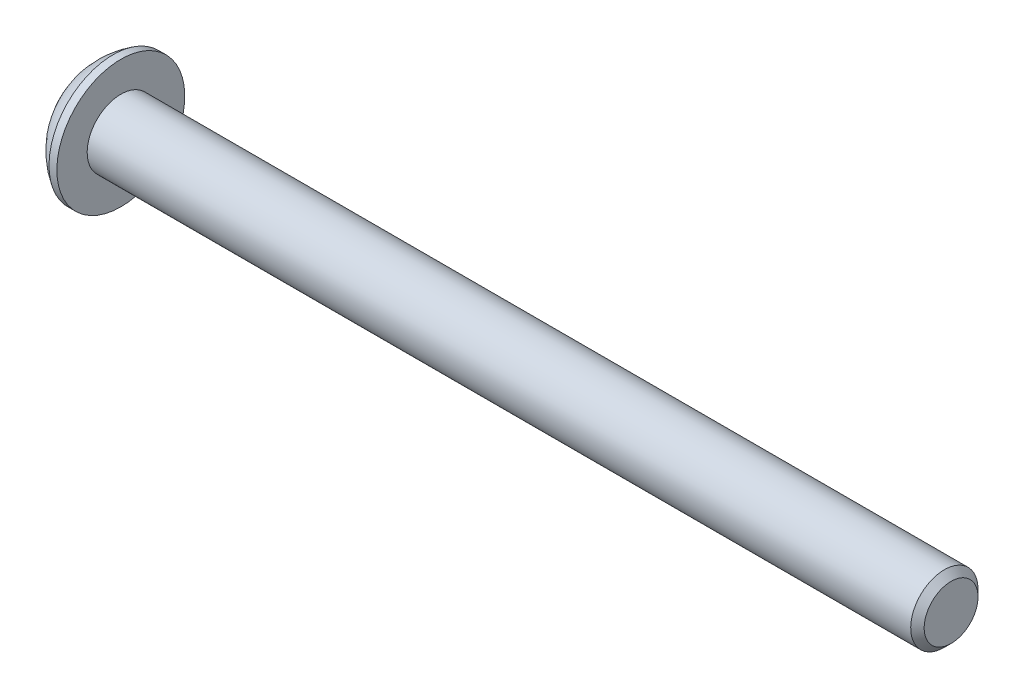
ISO-10303-21;
HEADER;
FILE_DESCRIPTION(('STEP AP214'),'2;1');
FILE_NAME('part.step','',(''),(''),'','','');
FILE_SCHEMA(('AUTOMOTIVE_DESIGN { 1 0 10303 214 1 1 1 1 }'));
ENDSEC;
DATA;
#1=APPLICATION_CONTEXT('core data for automotive mechanical design processes');
#2=APPLICATION_PROTOCOL_DEFINITION('international standard','automotive_design',2000,#1);
#3=PRODUCT_CONTEXT('',#1,'mechanical');
#4=PRODUCT('Part','Part','',(#3));
#5=PRODUCT_RELATED_PRODUCT_CATEGORY('part','',(#4));
#6=PRODUCT_DEFINITION_FORMATION('','',#4);
#7=PRODUCT_DEFINITION_CONTEXT('part definition',#1,'design');
#8=PRODUCT_DEFINITION('design','',#6,#7);
#9=PRODUCT_DEFINITION_SHAPE('','',#8);
#10=(LENGTH_UNIT() NAMED_UNIT(*) SI_UNIT(.MILLI.,.METRE.));
#11=(NAMED_UNIT(*) PLANE_ANGLE_UNIT() SI_UNIT($,.RADIAN.));
#12=(NAMED_UNIT(*) SI_UNIT($,.STERADIAN.) SOLID_ANGLE_UNIT());
#13=UNCERTAINTY_MEASURE_WITH_UNIT(LENGTH_MEASURE(1.E-05),#10,'distance_accuracy_value','');
#14=(GEOMETRIC_REPRESENTATION_CONTEXT(3) GLOBAL_UNCERTAINTY_ASSIGNED_CONTEXT((#13)) GLOBAL_UNIT_ASSIGNED_CONTEXT((#10,
#11,#12)) REPRESENTATION_CONTEXT('',''));
#15=CARTESIAN_POINT('',(0.,0.,0.));
#16=DIRECTION('',(0.,0.,1.));
#17=DIRECTION('',(1.,0.,0.));
#18=AXIS2_PLACEMENT_3D('',#15,#16,#17);
#19=CARTESIAN_POINT('',(-38.65,0.,0.));
#20=DIRECTION('',(1.,0.,0.));
#21=DIRECTION('',(0.,1.,0.));
#22=AXIS2_PLACEMENT_3D('',#19,#20,#21);
#23=PLANE('',#22);
#24=DIRECTION('',(0.,-0.5,-0.866025403784439));
#25=VECTOR('',#24,1.);
#26=CARTESIAN_POINT('',(-38.65,1.15470053837924,0.));
#27=LINE('',#26,#25);
#28=CARTESIAN_POINT('',(-38.65,1.15470053837924,0.));
#29=VERTEX_POINT('',#28);
#30=CARTESIAN_POINT('',(-38.65,0.577350269189619,-1.));
#31=VERTEX_POINT('',#30);
#32=EDGE_CURVE('E121',#29,#31,#27,.T.);
#33=ORIENTED_EDGE('',*,*,#32,.F.);
#34=DIRECTION('',(0.,0.5,-0.866025403784439));
#35=VECTOR('',#34,1.);
#36=CARTESIAN_POINT('',(-38.65,0.577350269189619,1.));
#37=LINE('',#36,#35);
#38=CARTESIAN_POINT('',(-38.65,0.577350269189619,1.));
#39=VERTEX_POINT('',#38);
#40=EDGE_CURVE('E47',#39,#29,#37,.T.);
#41=ORIENTED_EDGE('',*,*,#40,.F.);
#42=DIRECTION('',(0.,1.,0.));
#43=VECTOR('',#42,1.);
#44=CARTESIAN_POINT('',(-38.65,-0.577350269189633,1.));
#45=LINE('',#44,#43);
#46=CARTESIAN_POINT('',(-38.65,-0.577350269189633,1.));
#47=VERTEX_POINT('',#46);
#48=EDGE_CURVE('E130',#47,#39,#45,.T.);
#49=ORIENTED_EDGE('',*,*,#48,.F.);
#50=DIRECTION('',(0.,0.5,0.866025403784439));
#51=VECTOR('',#50,1.);
#52=CARTESIAN_POINT('',(-38.65,-1.15470053837926,0.));
#53=LINE('',#52,#51);
#54=CARTESIAN_POINT('',(-38.65,-1.15470053837926,0.));
#55=VERTEX_POINT('',#54);
#56=EDGE_CURVE('E128',#55,#47,#53,.T.);
#57=ORIENTED_EDGE('',*,*,#56,.F.);
#58=DIRECTION('',(0.,-0.5,0.866025403784439));
#59=VECTOR('',#58,1.);
#60=CARTESIAN_POINT('',(-38.65,-0.577350269189633,-1.));
#61=LINE('',#60,#59);
#62=CARTESIAN_POINT('',(-38.65,-0.577350269189633,-1.));
#63=VERTEX_POINT('',#62);
#64=EDGE_CURVE('E95',#63,#55,#61,.T.);
#65=ORIENTED_EDGE('',*,*,#64,.F.);
#66=DIRECTION('',(0.,-1.,0.));
#67=VECTOR('',#66,1.);
#68=CARTESIAN_POINT('',(-38.65,0.577350269189619,-1.));
#69=LINE('',#68,#67);
#70=EDGE_CURVE('E124',#31,#63,#69,.T.);
#71=ORIENTED_EDGE('',*,*,#70,.F.);
#72=EDGE_LOOP('',(#33,#41,#49,#57,#65,#71));
#73=FACE_BOUND('',#72,.T.);
#74=CARTESIAN_POINT('',(-38.65,0.,0.));
#75=DIRECTION('',(-1.,0.,0.));
#76=DIRECTION('',(0.,-1.,0.));
#77=AXIS2_PLACEMENT_3D('',#74,#75,#76);
#78=CIRCLE('',#77,1.425);
#79=CARTESIAN_POINT('',(-38.65,-1.425,0.));
#80=VERTEX_POINT('',#79);
#81=EDGE_CURVE('E148',#80,#80,#78,.T.);
#82=ORIENTED_EDGE('',*,*,#81,.T.);
#83=EDGE_LOOP('',(#82));
#84=FACE_BOUND('',#83,.T.);
#85=ADVANCED_FACE('F32',(#73,#84),#23,.F.);
#86=CARTESIAN_POINT('',(-35.629914268663,0.,0.));
#87=DIRECTION('',(-1.,0.,0.));
#88=DIRECTION('',(0.,-1.,0.));
#89=AXIS2_PLACEMENT_3D('',#86,#87,#88);
#90=DEGENERATE_TOROIDAL_SURFACE('',#89,0.0246834742021491,3.35,.F.);
#91=ORIENTED_EDGE('',*,*,#81,.F.);
#92=EDGE_LOOP('',(#91));
#93=FACE_BOUND('',#92,.T.);
#94=CARTESIAN_POINT('',(-37.35,0.,0.));
#95=DIRECTION('',(-1.,0.,0.));
#96=DIRECTION('',(0.,-1.,0.));
#97=AXIS2_PLACEMENT_3D('',#94,#95,#96);
#98=CIRCLE('',#97,2.85);
#99=CARTESIAN_POINT('',(-37.35,-2.85,0.));
#100=VERTEX_POINT('',#99);
#101=EDGE_CURVE('E145',#100,#100,#98,.T.);
#102=ORIENTED_EDGE('',*,*,#101,.T.);
#103=EDGE_LOOP('',(#102));
#104=FACE_BOUND('',#103,.T.);
#105=ADVANCED_FACE('F165',(#93,#104),#90,.F.);
#106=CARTESIAN_POINT('',(-45.1858407079646,0.,0.));
#107=DIRECTION('',(-1.,0.,0.));
#108=DIRECTION('',(0.,-1.,0.));
#109=AXIS2_PLACEMENT_3D('',#106,#107,#108);
#110=CYLINDRICAL_SURFACE('',#109,2.85);
#111=ORIENTED_EDGE('',*,*,#101,.F.);
#112=EDGE_LOOP('',(#111));
#113=FACE_BOUND('',#112,.T.);
#114=CARTESIAN_POINT('',(-37.,0.,0.));
#115=DIRECTION('',(-1.,0.,0.));
#116=DIRECTION('',(0.,-1.,0.));
#117=AXIS2_PLACEMENT_3D('',#114,#115,#116);
#118=CIRCLE('',#117,2.85);
#119=CARTESIAN_POINT('',(-37.,-2.85,0.));
#120=VERTEX_POINT('',#119);
#121=EDGE_CURVE('E142',#120,#120,#118,.T.);
#122=ORIENTED_EDGE('',*,*,#121,.T.);
#123=EDGE_LOOP('',(#122));
#124=FACE_BOUND('',#123,.T.);
#125=ADVANCED_FACE('F170',(#113,#124),#110,.T.);
#126=CARTESIAN_POINT('',(-37.,2.85,0.));
#127=DIRECTION('',(-1.,0.,0.));
#128=DIRECTION('',(0.,-1.,0.));
#129=AXIS2_PLACEMENT_3D('',#126,#127,#128);
#130=PLANE('',#129);
#131=ORIENTED_EDGE('',*,*,#121,.F.);
#132=EDGE_LOOP('',(#131));
#133=FACE_BOUND('',#132,.T.);
#134=CARTESIAN_POINT('',(-37.,0.,0.));
#135=DIRECTION('',(-1.,0.,0.));
#136=DIRECTION('',(0.,-1.,0.));
#137=AXIS2_PLACEMENT_3D('',#134,#135,#136);
#138=CIRCLE('',#137,1.5);
#139=CARTESIAN_POINT('',(-37.,-1.5,0.));
#140=VERTEX_POINT('',#139);
#141=EDGE_CURVE('E134',#140,#140,#138,.T.);
#142=ORIENTED_EDGE('',*,*,#141,.T.);
#143=EDGE_LOOP('',(#142));
#144=FACE_BOUND('',#143,.T.);
#145=ADVANCED_FACE('F178',(#133,#144),#130,.F.);
#146=CARTESIAN_POINT('',(-45.1858407079646,0.,0.));
#147=DIRECTION('',(-1.,0.,0.));
#148=DIRECTION('',(0.,-1.,0.));
#149=AXIS2_PLACEMENT_3D('',#146,#147,#148);
#150=CYLINDRICAL_SURFACE('',#149,1.5);
#151=CARTESIAN_POINT('',(-0.300000000000016,0.,0.));
#152=DIRECTION('',(-1.,0.,0.));
#153=DIRECTION('',(0.,-1.,0.));
#154=AXIS2_PLACEMENT_3D('',#151,#152,#153);
#155=CIRCLE('',#154,1.5);
#156=CARTESIAN_POINT('',(-0.300000000000015,-1.49999999999999,0.));
#157=VERTEX_POINT('',#156);
#158=EDGE_CURVE('E40',#157,#157,#155,.T.);
#159=ORIENTED_EDGE('',*,*,#158,.T.);
#160=EDGE_LOOP('',(#159));
#161=FACE_BOUND('',#160,.T.);
#162=ORIENTED_EDGE('',*,*,#141,.F.);
#163=EDGE_LOOP('',(#162));
#164=FACE_BOUND('',#163,.T.);
#165=ADVANCED_FACE('F153',(#161,#164),#150,.T.);
#166=CARTESIAN_POINT('',(0.,1.5,0.));
#167=DIRECTION('',(-1.,0.,0.));
#168=DIRECTION('',(0.,-1.,0.));
#169=AXIS2_PLACEMENT_3D('',#166,#167,#168);
#170=PLANE('',#169);
#171=CARTESIAN_POINT('',(0.,0.,0.));
#172=DIRECTION('',(-1.,0.,0.));
#173=DIRECTION('',(0.,-1.,0.));
#174=AXIS2_PLACEMENT_3D('',#171,#172,#173);
#175=CIRCLE('',#174,1.19999999999999);
#176=CARTESIAN_POINT('',(0.,-1.19999999999998,0.));
#177=VERTEX_POINT('',#176);
#178=EDGE_CURVE('E11',#177,#177,#175,.F.);
#179=ORIENTED_EDGE('',*,*,#178,.T.);
#180=EDGE_LOOP('',(#179));
#181=FACE_BOUND('',#180,.T.);
#182=ADVANCED_FACE('F185',(#181),#170,.F.);
#183=CARTESIAN_POINT('',(-37.65,0.577350269189619,1.));
#184=DIRECTION('',(0.,0.866025403784439,0.5));
#185=DIRECTION('',(0.,-0.5,0.866025403784439));
#186=AXIS2_PLACEMENT_3D('',#183,#184,#185);
#187=PLANE('',#186);
#188=ORIENTED_EDGE('',*,*,#40,.T.);
#189=DIRECTION('',(-1.,0.,0.));
#190=VECTOR('',#189,1.);
#191=CARTESIAN_POINT('',(-37.65,1.15470053837924,0.));
#192=LINE('',#191,#190);
#193=CARTESIAN_POINT('',(-37.65,1.15470053837924,0.));
#194=VERTEX_POINT('',#193);
#195=EDGE_CURVE('E77',#194,#29,#192,.T.);
#196=ORIENTED_EDGE('',*,*,#195,.F.);
#197=DIRECTION('',(0.,0.5,-0.866025403784439));
#198=VECTOR('',#197,1.);
#199=CARTESIAN_POINT('',(-37.65,0.577350269189619,1.));
#200=LINE('',#199,#198);
#201=CARTESIAN_POINT('',(-37.65,0.577350269189619,1.));
#202=VERTEX_POINT('',#201);
#203=EDGE_CURVE('E132',#202,#194,#200,.T.);
#204=ORIENTED_EDGE('',*,*,#203,.F.);
#205=DIRECTION('',(-1.,0.,0.));
#206=VECTOR('',#205,1.);
#207=CARTESIAN_POINT('',(-37.65,0.577350269189619,1.));
#208=LINE('',#207,#206);
#209=EDGE_CURVE('E55',#202,#39,#208,.T.);
#210=ORIENTED_EDGE('',*,*,#209,.T.);
#211=EDGE_LOOP('',(#188,#196,#204,#210));
#212=FACE_BOUND('',#211,.T.);
#213=ADVANCED_FACE('F188',(#212),#187,.F.);
#214=CARTESIAN_POINT('',(-37.65,-0.577350269189633,1.));
#215=DIRECTION('',(0.,0.,1.));
#216=DIRECTION('',(0.,-1.,0.));
#217=AXIS2_PLACEMENT_3D('',#214,#215,#216);
#218=PLANE('',#217);
#219=ORIENTED_EDGE('',*,*,#48,.T.);
#220=ORIENTED_EDGE('',*,*,#209,.F.);
#221=DIRECTION('',(0.,1.,0.));
#222=VECTOR('',#221,1.);
#223=CARTESIAN_POINT('',(-37.65,-0.577350269189633,1.));
#224=LINE('',#223,#222);
#225=CARTESIAN_POINT('',(-37.65,-0.577350269189633,1.));
#226=VERTEX_POINT('',#225);
#227=EDGE_CURVE('E107',#226,#202,#224,.T.);
#228=ORIENTED_EDGE('',*,*,#227,.F.);
#229=DIRECTION('',(-1.,0.,0.));
#230=VECTOR('',#229,1.);
#231=CARTESIAN_POINT('',(-37.65,-0.577350269189633,1.));
#232=LINE('',#231,#230);
#233=EDGE_CURVE('E99',#226,#47,#232,.T.);
#234=ORIENTED_EDGE('',*,*,#233,.T.);
#235=EDGE_LOOP('',(#219,#220,#228,#234));
#236=FACE_BOUND('',#235,.T.);
#237=ADVANCED_FACE('F192',(#236),#218,.F.);
#238=CARTESIAN_POINT('',(-37.65,-1.15470053837926,0.));
#239=DIRECTION('',(0.,-0.866025403784439,0.5));
#240=DIRECTION('',(0.,-0.5,-0.866025403784439));
#241=AXIS2_PLACEMENT_3D('',#238,#239,#240);
#242=PLANE('',#241);
#243=ORIENTED_EDGE('',*,*,#56,.T.);
#244=ORIENTED_EDGE('',*,*,#233,.F.);
#245=DIRECTION('',(0.,0.5,0.866025403784439));
#246=VECTOR('',#245,1.);
#247=CARTESIAN_POINT('',(-37.65,-1.15470053837926,0.));
#248=LINE('',#247,#246);
#249=CARTESIAN_POINT('',(-37.65,-1.15470053837926,0.));
#250=VERTEX_POINT('',#249);
#251=EDGE_CURVE('E103',#250,#226,#248,.T.);
#252=ORIENTED_EDGE('',*,*,#251,.F.);
#253=DIRECTION('',(-1.,0.,0.));
#254=VECTOR('',#253,1.);
#255=CARTESIAN_POINT('',(-37.65,-1.15470053837926,0.));
#256=LINE('',#255,#254);
#257=EDGE_CURVE('E88',#250,#55,#256,.T.);
#258=ORIENTED_EDGE('',*,*,#257,.T.);
#259=EDGE_LOOP('',(#243,#244,#252,#258));
#260=FACE_BOUND('',#259,.T.);
#261=ADVANCED_FACE('F104',(#260),#242,.F.);
#262=CARTESIAN_POINT('',(-37.65,-0.577350269189633,-1.));
#263=DIRECTION('',(0.,-0.866025403784439,-0.5));
#264=DIRECTION('',(0.,0.5,-0.866025403784439));
#265=AXIS2_PLACEMENT_3D('',#262,#263,#264);
#266=PLANE('',#265);
#267=ORIENTED_EDGE('',*,*,#64,.T.);
#268=ORIENTED_EDGE('',*,*,#257,.F.);
#269=DIRECTION('',(0.,-0.5,0.866025403784439));
#270=VECTOR('',#269,1.);
#271=CARTESIAN_POINT('',(-37.65,-0.577350269189633,-1.));
#272=LINE('',#271,#270);
#273=CARTESIAN_POINT('',(-37.65,-0.577350269189633,-1.));
#274=VERTEX_POINT('',#273);
#275=EDGE_CURVE('E92',#274,#250,#272,.T.);
#276=ORIENTED_EDGE('',*,*,#275,.F.);
#277=DIRECTION('',(-1.,0.,0.));
#278=VECTOR('',#277,1.);
#279=CARTESIAN_POINT('',(-37.65,-0.577350269189633,-1.));
#280=LINE('',#279,#278);
#281=EDGE_CURVE('E100',#274,#63,#280,.T.);
#282=ORIENTED_EDGE('',*,*,#281,.T.);
#283=EDGE_LOOP('',(#267,#268,#276,#282));
#284=FACE_BOUND('',#283,.T.);
#285=ADVANCED_FACE('F90',(#284),#266,.F.);
#286=CARTESIAN_POINT('',(-37.65,0.577350269189619,-1.));
#287=DIRECTION('',(0.,0.,-1.));
#288=DIRECTION('',(-1.,0.,0.));
#289=AXIS2_PLACEMENT_3D('',#286,#287,#288);
#290=PLANE('',#289);
#291=ORIENTED_EDGE('',*,*,#70,.T.);
#292=ORIENTED_EDGE('',*,*,#281,.F.);
#293=DIRECTION('',(0.,-1.,0.));
#294=VECTOR('',#293,1.);
#295=CARTESIAN_POINT('',(-37.65,0.577350269189619,-1.));
#296=LINE('',#295,#294);
#297=CARTESIAN_POINT('',(-37.65,0.577350269189619,-1.));
#298=VERTEX_POINT('',#297);
#299=EDGE_CURVE('E113',#298,#274,#296,.T.);
#300=ORIENTED_EDGE('',*,*,#299,.F.);
#301=DIRECTION('',(-1.,0.,0.));
#302=VECTOR('',#301,1.);
#303=CARTESIAN_POINT('',(-37.65,0.577350269189619,-1.));
#304=LINE('',#303,#302);
#305=EDGE_CURVE('E137',#298,#31,#304,.T.);
#306=ORIENTED_EDGE('',*,*,#305,.T.);
#307=EDGE_LOOP('',(#291,#292,#300,#306));
#308=FACE_BOUND('',#307,.T.);
#309=ADVANCED_FACE('F195',(#308),#290,.F.);
#310=CARTESIAN_POINT('',(-37.65,1.15470053837924,0.));
#311=DIRECTION('',(0.,0.866025403784439,-0.5));
#312=DIRECTION('',(0.,0.5,0.866025403784439));
#313=AXIS2_PLACEMENT_3D('',#310,#311,#312);
#314=PLANE('',#313);
#315=ORIENTED_EDGE('',*,*,#32,.T.);
#316=ORIENTED_EDGE('',*,*,#305,.F.);
#317=DIRECTION('',(0.,-0.5,-0.866025403784439));
#318=VECTOR('',#317,1.);
#319=CARTESIAN_POINT('',(-37.65,1.15470053837924,0.));
#320=LINE('',#319,#318);
#321=EDGE_CURVE('E115',#194,#298,#320,.T.);
#322=ORIENTED_EDGE('',*,*,#321,.F.);
#323=ORIENTED_EDGE('',*,*,#195,.T.);
#324=EDGE_LOOP('',(#315,#316,#322,#323));
#325=FACE_BOUND('',#324,.T.);
#326=ADVANCED_FACE('F161',(#325),#314,.F.);
#327=CARTESIAN_POINT('',(-37.65,0.,0.));
#328=DIRECTION('',(-1.,0.,0.));
#329=DIRECTION('',(0.,0.,1.));
#330=AXIS2_PLACEMENT_3D('',#327,#328,#329);
#331=PLANE('',#330);
#332=ORIENTED_EDGE('',*,*,#203,.T.);
#333=ORIENTED_EDGE('',*,*,#321,.T.);
#334=ORIENTED_EDGE('',*,*,#299,.T.);
#335=ORIENTED_EDGE('',*,*,#275,.T.);
#336=ORIENTED_EDGE('',*,*,#251,.T.);
#337=ORIENTED_EDGE('',*,*,#227,.T.);
#338=EDGE_LOOP('',(#332,#333,#334,#335,#336,#337));
#339=FACE_BOUND('',#338,.T.);
#340=ADVANCED_FACE('F110',(#339),#331,.T.);
#341=CARTESIAN_POINT('',(-0.300000000000016,0.,0.));
#342=DIRECTION('',(-1.,0.,0.));
#343=DIRECTION('',(0.,-1.,0.));
#344=AXIS2_PLACEMENT_3D('',#341,#342,#343);
#345=CONICAL_SURFACE('',#344,1.5,0.785398163397444);
#346=ORIENTED_EDGE('',*,*,#178,.F.);
#347=EDGE_LOOP('',(#346));
#348=FACE_BOUND('',#347,.T.);
#349=ORIENTED_EDGE('',*,*,#158,.F.);
#350=EDGE_LOOP('',(#349));
#351=FACE_BOUND('',#350,.T.);
#352=ADVANCED_FACE('F34',(#348,#351),#345,.T.);
#353=CLOSED_SHELL('',(#85,#105,#125,#145,#165,#182,#213,#237,#261,#285,#309,#326,#340,#352));
#354=MANIFOLD_SOLID_BREP('B2',#353);
#355=ADVANCED_BREP_SHAPE_REPRESENTATION('',(#18,#354),#14);
#356=SHAPE_DEFINITION_REPRESENTATION(#9,#355);
ENDSEC;
END-ISO-10303-21;
